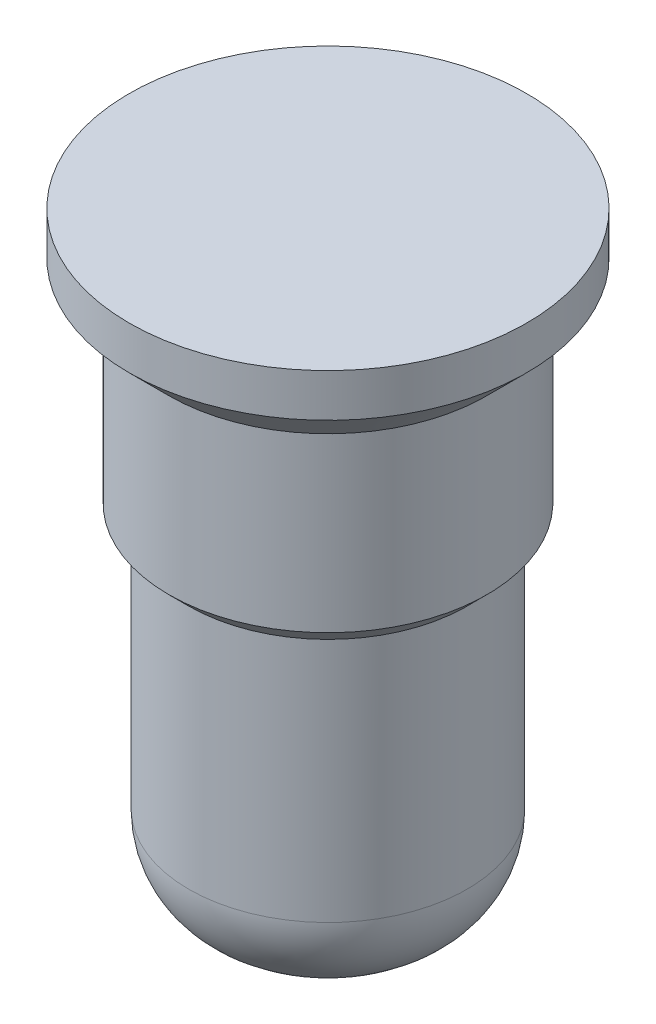
ISO-10303-21;
HEADER;
FILE_DESCRIPTION(('STEP AP214'),'2;1');
FILE_NAME('part.step','',(''),(''),'','','');
FILE_SCHEMA(('AUTOMOTIVE_DESIGN { 1 0 10303 214 1 1 1 1 }'));
ENDSEC;
DATA;
#1=APPLICATION_CONTEXT('core data for automotive mechanical design processes');
#2=APPLICATION_PROTOCOL_DEFINITION('international standard','automotive_design',2000,#1);
#3=PRODUCT_CONTEXT('',#1,'mechanical');
#4=PRODUCT('Part','Part','',(#3));
#5=PRODUCT_RELATED_PRODUCT_CATEGORY('part','',(#4));
#6=PRODUCT_DEFINITION_FORMATION('','',#4);
#7=PRODUCT_DEFINITION_CONTEXT('part definition',#1,'design');
#8=PRODUCT_DEFINITION('design','',#6,#7);
#9=PRODUCT_DEFINITION_SHAPE('','',#8);
#10=(LENGTH_UNIT() NAMED_UNIT(*) SI_UNIT(.MILLI.,.METRE.));
#11=(NAMED_UNIT(*) PLANE_ANGLE_UNIT() SI_UNIT($,.RADIAN.));
#12=(NAMED_UNIT(*) SI_UNIT($,.STERADIAN.) SOLID_ANGLE_UNIT());
#13=UNCERTAINTY_MEASURE_WITH_UNIT(LENGTH_MEASURE(1.E-05),#10,'distance_accuracy_value','');
#14=(GEOMETRIC_REPRESENTATION_CONTEXT(3) GLOBAL_UNCERTAINTY_ASSIGNED_CONTEXT((#13)) GLOBAL_UNIT_ASSIGNED_CONTEXT((#10,
#11,#12)) REPRESENTATION_CONTEXT('',''));
#15=CARTESIAN_POINT('',(0.,0.,0.));
#16=DIRECTION('',(0.,0.,1.));
#17=DIRECTION('',(1.,0.,0.));
#18=AXIS2_PLACEMENT_3D('',#15,#16,#17);
#19=CARTESIAN_POINT('',(0.,0.79375,0.));
#20=DIRECTION('',(0.,-1.,0.));
#21=DIRECTION('',(0.,0.,-1.));
#22=AXIS2_PLACEMENT_3D('',#19,#20,#21);
#23=CYLINDRICAL_SURFACE('',#22,1.905);
#24=CARTESIAN_POINT('',(0.,0.381000000000001,0.));
#25=DIRECTION('',(0.,1.,0.));
#26=DIRECTION('',(0.,0.,1.));
#27=AXIS2_PLACEMENT_3D('',#24,#25,#26);
#28=CIRCLE('',#27,1.905);
#29=CARTESIAN_POINT('',(0.,0.381000000000001,1.905));
#30=VERTEX_POINT('',#29);
#31=EDGE_CURVE('E60',#30,#30,#28,.T.);
#32=ORIENTED_EDGE('',*,*,#31,.T.);
#33=EDGE_LOOP('',(#32));
#34=FACE_BOUND('',#33,.T.);
#35=CARTESIAN_POINT('',(0.,0.79375,0.));
#36=DIRECTION('',(0.,1.,0.));
#37=DIRECTION('',(0.,0.,1.));
#38=AXIS2_PLACEMENT_3D('',#35,#36,#37);
#39=CIRCLE('',#38,1.905);
#40=CARTESIAN_POINT('',(0.,0.79375,1.905));
#41=VERTEX_POINT('',#40);
#42=EDGE_CURVE('E64',#41,#41,#39,.T.);
#43=ORIENTED_EDGE('',*,*,#42,.F.);
#44=EDGE_LOOP('',(#43));
#45=FACE_BOUND('',#44,.T.);
#46=ADVANCED_FACE('F39',(#34,#45),#23,.T.);
#47=CARTESIAN_POINT('',(0.,0.79375,0.));
#48=DIRECTION('',(0.,1.,0.));
#49=DIRECTION('',(0.,0.,1.));
#50=AXIS2_PLACEMENT_3D('',#47,#48,#49);
#51=PLANE('',#50);
#52=ORIENTED_EDGE('',*,*,#42,.T.);
#53=EDGE_LOOP('',(#52));
#54=FACE_BOUND('',#53,.T.);
#55=ADVANCED_FACE('F81',(#54),#51,.T.);
#56=CARTESIAN_POINT('',(0.,-2.54,0.));
#57=DIRECTION('',(0.,1.,0.));
#58=DIRECTION('',(0.,0.,1.));
#59=AXIS2_PLACEMENT_3D('',#56,#57,#58);
#60=CYLINDRICAL_SURFACE('',#59,1.524);
#61=CARTESIAN_POINT('',(0.,-1.65099999999999,0.));
#62=DIRECTION('',(0.,-1.,0.));
#63=DIRECTION('',(0.,0.,-1.));
#64=AXIS2_PLACEMENT_3D('',#61,#62,#63);
#65=CIRCLE('',#64,1.524);
#66=CARTESIAN_POINT('',(0.,-1.65099999999999,-1.524));
#67=VERTEX_POINT('',#66);
#68=EDGE_CURVE('E47',#67,#67,#65,.F.);
#69=ORIENTED_EDGE('',*,*,#68,.T.);
#70=EDGE_LOOP('',(#69));
#71=FACE_BOUND('',#70,.T.);
#72=CARTESIAN_POINT('',(0.,0.,0.));
#73=DIRECTION('',(0.,-1.,0.));
#74=DIRECTION('',(0.,0.,-1.));
#75=AXIS2_PLACEMENT_3D('',#72,#73,#74);
#76=CIRCLE('',#75,1.524);
#77=CARTESIAN_POINT('',(0.,0.,-1.524));
#78=VERTEX_POINT('',#77);
#79=EDGE_CURVE('E63',#78,#78,#76,.T.);
#80=ORIENTED_EDGE('',*,*,#79,.T.);
#81=EDGE_LOOP('',(#80));
#82=FACE_BOUND('',#81,.T.);
#83=ADVANCED_FACE('F70',(#71,#82),#60,.T.);
#84=CARTESIAN_POINT('',(0.,0.381000000000001,0.));
#85=DIRECTION('',(0.,1.,0.));
#86=DIRECTION('',(0.,0.,1.));
#87=AXIS2_PLACEMENT_3D('',#84,#85,#86);
#88=CONICAL_SURFACE('',#87,1.905,0.785398163397449);
#89=ORIENTED_EDGE('',*,*,#79,.F.);
#90=EDGE_LOOP('',(#89));
#91=FACE_BOUND('',#90,.T.);
#92=ORIENTED_EDGE('',*,*,#31,.F.);
#93=EDGE_LOOP('',(#92));
#94=FACE_BOUND('',#93,.T.);
#95=ADVANCED_FACE('F72',(#91,#94),#88,.T.);
#96=CARTESIAN_POINT('',(0.,-5.08,0.));
#97=DIRECTION('',(0.,1.,0.));
#98=DIRECTION('',(0.,0.,1.));
#99=AXIS2_PLACEMENT_3D('',#96,#97,#98);
#100=CYLINDRICAL_SURFACE('',#99,1.3335);
#101=CARTESIAN_POINT('',(0.,-1.84149999999999,0.));
#102=DIRECTION('',(0.,1.,0.));
#103=DIRECTION('',(0.,0.,1.));
#104=AXIS2_PLACEMENT_3D('',#101,#102,#103);
#105=CIRCLE('',#104,1.3335);
#106=CARTESIAN_POINT('',(0.,-1.84149999999999,1.3335));
#107=VERTEX_POINT('',#106);
#108=EDGE_CURVE('E10',#107,#107,#105,.F.);
#109=ORIENTED_EDGE('',*,*,#108,.T.);
#110=EDGE_LOOP('',(#109));
#111=FACE_BOUND('',#110,.T.);
#112=CARTESIAN_POINT('',(0.,-4.191,0.));
#113=DIRECTION('',(0.,-1.,0.));
#114=DIRECTION('',(0.,0.,-1.));
#115=AXIS2_PLACEMENT_3D('',#112,#113,#114);
#116=CIRCLE('',#115,1.3335);
#117=CARTESIAN_POINT('',(0.,-4.191,-1.3335));
#118=VERTEX_POINT('',#117);
#119=EDGE_CURVE('E51',#118,#118,#116,.F.);
#120=ORIENTED_EDGE('',*,*,#119,.T.);
#121=EDGE_LOOP('',(#120));
#122=FACE_BOUND('',#121,.T.);
#123=ADVANCED_FACE('F75',(#111,#122),#100,.T.);
#124=CARTESIAN_POINT('',(0.,-5.08,0.));
#125=DIRECTION('',(0.,-1.,0.));
#126=DIRECTION('',(0.,0.,-1.));
#127=AXIS2_PLACEMENT_3D('',#124,#125,#126);
#128=PLANE('',#127);
#129=CARTESIAN_POINT('',(0.,-5.08,0.));
#130=DIRECTION('',(0.,-1.,0.));
#131=DIRECTION('',(0.,0.,-1.));
#132=AXIS2_PLACEMENT_3D('',#129,#130,#131);
#133=CIRCLE('',#132,0.4445);
#134=CARTESIAN_POINT('',(0.,-5.08,-0.4445));
#135=VERTEX_POINT('',#134);
#136=EDGE_CURVE('E55',#135,#135,#133,.T.);
#137=ORIENTED_EDGE('',*,*,#136,.T.);
#138=EDGE_LOOP('',(#137));
#139=FACE_BOUND('',#138,.T.);
#140=ADVANCED_FACE('F97',(#139),#128,.T.);
#141=CARTESIAN_POINT('',(0.,-4.191,0.));
#142=DIRECTION('',(0.,-1.,0.));
#143=DIRECTION('',(0.,0.,-1.));
#144=AXIS2_PLACEMENT_3D('',#141,#142,#143);
#145=DEGENERATE_TOROIDAL_SURFACE('',#144,0.4445,0.889,.T.);
#146=ORIENTED_EDGE('',*,*,#119,.F.);
#147=EDGE_LOOP('',(#146));
#148=FACE_BOUND('',#147,.T.);
#149=ORIENTED_EDGE('',*,*,#136,.F.);
#150=EDGE_LOOP('',(#149));
#151=FACE_BOUND('',#150,.T.);
#152=ADVANCED_FACE('F95',(#148,#151),#145,.T.);
#153=CARTESIAN_POINT('',(0.,-2.54,0.));
#154=DIRECTION('',(0.,1.,0.));
#155=DIRECTION('',(0.,0.,1.));
#156=AXIS2_PLACEMENT_3D('',#153,#154,#155);
#157=CONICAL_SURFACE('',#156,0.634999999999984,0.785398163397453);
#158=ORIENTED_EDGE('',*,*,#68,.F.);
#159=EDGE_LOOP('',(#158));
#160=FACE_BOUND('',#159,.T.);
#161=ORIENTED_EDGE('',*,*,#108,.F.);
#162=EDGE_LOOP('',(#161));
#163=FACE_BOUND('',#162,.T.);
#164=ADVANCED_FACE('F42',(#160,#163),#157,.T.);
#165=CLOSED_SHELL('',(#46,#55,#83,#95,#123,#140,#152,#164));
#166=MANIFOLD_SOLID_BREP('B2',#165);
#167=ADVANCED_BREP_SHAPE_REPRESENTATION('',(#18,#166),#14);
#168=SHAPE_DEFINITION_REPRESENTATION(#9,#167);
ENDSEC;
END-ISO-10303-21;
